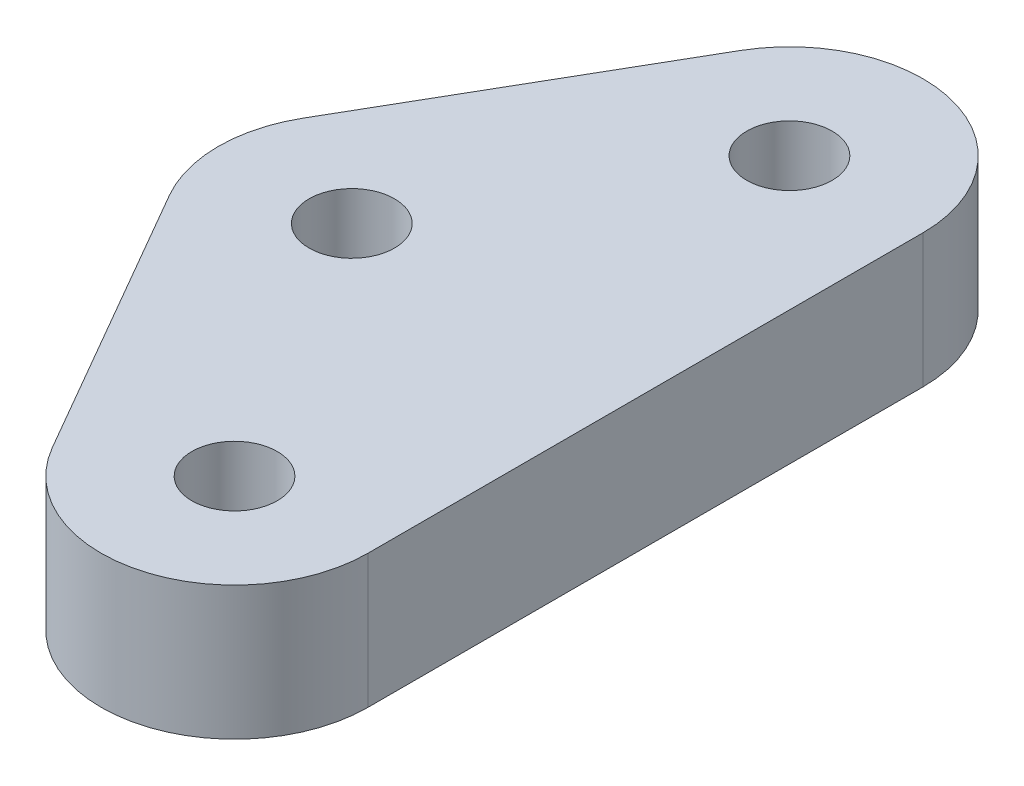
ISO-10303-21;
HEADER;
FILE_DESCRIPTION(('STEP AP214'),'2;1');
FILE_NAME('part.step','',(''),(''),'','','');
FILE_SCHEMA(('AUTOMOTIVE_DESIGN { 1 0 10303 214 1 1 1 1 }'));
ENDSEC;
DATA;
#1=APPLICATION_CONTEXT('core data for automotive mechanical design processes');
#2=APPLICATION_PROTOCOL_DEFINITION('international standard','automotive_design',2000,#1);
#3=PRODUCT_CONTEXT('',#1,'mechanical');
#4=PRODUCT('Part','Part','',(#3));
#5=PRODUCT_RELATED_PRODUCT_CATEGORY('part','',(#4));
#6=PRODUCT_DEFINITION_FORMATION('','',#4);
#7=PRODUCT_DEFINITION_CONTEXT('part definition',#1,'design');
#8=PRODUCT_DEFINITION('design','',#6,#7);
#9=PRODUCT_DEFINITION_SHAPE('','',#8);
#10=(LENGTH_UNIT() NAMED_UNIT(*) SI_UNIT(.MILLI.,.METRE.));
#11=(NAMED_UNIT(*) PLANE_ANGLE_UNIT() SI_UNIT($,.RADIAN.));
#12=(NAMED_UNIT(*) SI_UNIT($,.STERADIAN.) SOLID_ANGLE_UNIT());
#13=UNCERTAINTY_MEASURE_WITH_UNIT(LENGTH_MEASURE(1.E-05),#10,'distance_accuracy_value','');
#14=(GEOMETRIC_REPRESENTATION_CONTEXT(3) GLOBAL_UNCERTAINTY_ASSIGNED_CONTEXT((#13)) GLOBAL_UNIT_ASSIGNED_CONTEXT((#10,
#11,#12)) REPRESENTATION_CONTEXT('',''));
#15=CARTESIAN_POINT('',(0.,0.,0.));
#16=DIRECTION('',(0.,0.,1.));
#17=DIRECTION('',(1.,0.,0.));
#18=AXIS2_PLACEMENT_3D('',#15,#16,#17);
#19=CARTESIAN_POINT('',(5.99999999999998,5.,-10.3923048454133));
#20=DIRECTION('',(0.,1.,0.));
#21=DIRECTION('',(0.,0.,1.));
#22=AXIS2_PLACEMENT_3D('',#19,#20,#21);
#23=PLANE('',#22);
#24=CARTESIAN_POINT('',(5.99999999999998,5.,-10.3923048454133));
#25=DIRECTION('',(0.,1.,0.));
#26=DIRECTION('',(0.,0.,1.));
#27=AXIS2_PLACEMENT_3D('',#24,#25,#26);
#28=CIRCLE('',#27,1.6);
#29=CARTESIAN_POINT('',(5.99999999999998,5.,-8.79230484541328));
#30=VERTEX_POINT('',#29);
#31=EDGE_CURVE('E184',#30,#30,#28,.T.);
#32=ORIENTED_EDGE('',*,*,#31,.F.);
#33=EDGE_LOOP('',(#32));
#34=FACE_BOUND('',#33,.T.);
#35=CARTESIAN_POINT('',(5.99999999999998,5.,-10.3923048454133));
#36=DIRECTION('',(0.,1.,0.));
#37=DIRECTION('',(0.,0.,1.));
#38=AXIS2_PLACEMENT_3D('',#35,#36,#37);
#39=CIRCLE('',#38,5.);
#40=CARTESIAN_POINT('',(11.,5.,-10.3923048454133));
#41=VERTEX_POINT('',#40);
#42=CARTESIAN_POINT('',(1.66987298107778,5.,-12.8923048454133));
#43=VERTEX_POINT('',#42);
#44=EDGE_CURVE('E129',#41,#43,#39,.T.);
#45=ORIENTED_EDGE('',*,*,#44,.T.);
#46=DIRECTION('',(-0.499999999999998,0.,0.86602540378444));
#47=VECTOR('',#46,1.);
#48=CARTESIAN_POINT('',(-4.3301270189222,5.,-2.49999999999999));
#49=LINE('',#48,#47);
#50=CARTESIAN_POINT('',(-4.3301270189222,5.,-2.49999999999999));
#51=VERTEX_POINT('',#50);
#52=EDGE_CURVE('E87',#43,#51,#49,.T.);
#53=ORIENTED_EDGE('',*,*,#52,.T.);
#54=CARTESIAN_POINT('',(0.,5.,0.));
#55=DIRECTION('',(0.,1.,0.));
#56=DIRECTION('',(0.,0.,1.));
#57=AXIS2_PLACEMENT_3D('',#54,#55,#56);
#58=CIRCLE('',#57,5.);
#59=CARTESIAN_POINT('',(-4.3301270189222,5.,2.49999999999999));
#60=VERTEX_POINT('',#59);
#61=EDGE_CURVE('E100',#51,#60,#58,.T.);
#62=ORIENTED_EDGE('',*,*,#61,.T.);
#63=DIRECTION('',(0.499999999999998,0.,0.86602540378444));
#64=VECTOR('',#63,1.);
#65=CARTESIAN_POINT('',(-4.3301270189222,5.,2.49999999999999));
#66=LINE('',#65,#64);
#67=CARTESIAN_POINT('',(1.66987298107778,5.,12.8923048454133));
#68=VERTEX_POINT('',#67);
#69=EDGE_CURVE('E94',#60,#68,#66,.T.);
#70=ORIENTED_EDGE('',*,*,#69,.T.);
#71=CARTESIAN_POINT('',(5.99999999999998,5.,10.3923048454133));
#72=DIRECTION('',(0.,1.,0.));
#73=DIRECTION('',(0.,0.,1.));
#74=AXIS2_PLACEMENT_3D('',#71,#72,#73);
#75=CIRCLE('',#74,5.);
#76=CARTESIAN_POINT('',(11.,5.,10.3923048454133));
#77=VERTEX_POINT('',#76);
#78=EDGE_CURVE('E98',#68,#77,#75,.T.);
#79=ORIENTED_EDGE('',*,*,#78,.T.);
#80=DIRECTION('',(0.,0.,-1.));
#81=VECTOR('',#80,1.);
#82=CARTESIAN_POINT('',(11.,5.,-10.3923048454133));
#83=LINE('',#82,#81);
#84=EDGE_CURVE('E50',#77,#41,#83,.T.);
#85=ORIENTED_EDGE('',*,*,#84,.T.);
#86=EDGE_LOOP('',(#45,#53,#62,#70,#79,#85));
#87=FACE_BOUND('',#86,.T.);
#88=CARTESIAN_POINT('',(0.,5.,0.));
#89=DIRECTION('',(0.,1.,0.));
#90=DIRECTION('',(0.,0.,1.));
#91=AXIS2_PLACEMENT_3D('',#88,#89,#90);
#92=CIRCLE('',#91,1.6);
#93=CARTESIAN_POINT('',(0.,5.,1.6));
#94=VERTEX_POINT('',#93);
#95=EDGE_CURVE('E122',#94,#94,#92,.T.);
#96=ORIENTED_EDGE('',*,*,#95,.F.);
#97=EDGE_LOOP('',(#96));
#98=FACE_BOUND('',#97,.T.);
#99=CARTESIAN_POINT('',(5.99999999999998,5.,10.3923048454133));
#100=DIRECTION('',(0.,1.,0.));
#101=DIRECTION('',(0.,0.,1.));
#102=AXIS2_PLACEMENT_3D('',#99,#100,#101);
#103=CIRCLE('',#102,1.6);
#104=CARTESIAN_POINT('',(5.99999999999998,5.,11.9923048454133));
#105=VERTEX_POINT('',#104);
#106=EDGE_CURVE('E175',#105,#105,#103,.T.);
#107=ORIENTED_EDGE('',*,*,#106,.F.);
#108=EDGE_LOOP('',(#107));
#109=FACE_BOUND('',#108,.T.);
#110=ADVANCED_FACE('F33',(#34,#87,#98,#109),#23,.T.);
#111=CARTESIAN_POINT('',(5.99999999999998,0.,-10.3923048454133));
#112=DIRECTION('',(0.,1.,0.));
#113=DIRECTION('',(0.,0.,1.));
#114=AXIS2_PLACEMENT_3D('',#111,#112,#113);
#115=PLANE('',#114);
#116=CARTESIAN_POINT('',(5.99999999999998,0.,-10.3923048454133));
#117=DIRECTION('',(0.,1.,0.));
#118=DIRECTION('',(0.,0.,1.));
#119=AXIS2_PLACEMENT_3D('',#116,#117,#118);
#120=CIRCLE('',#119,5.);
#121=CARTESIAN_POINT('',(11.,0.,-10.3923048454133));
#122=VERTEX_POINT('',#121);
#123=CARTESIAN_POINT('',(1.66987298107778,0.,-12.8923048454133));
#124=VERTEX_POINT('',#123);
#125=EDGE_CURVE('E118',#122,#124,#120,.T.);
#126=ORIENTED_EDGE('',*,*,#125,.F.);
#127=DIRECTION('',(0.,0.,-1.));
#128=VECTOR('',#127,1.);
#129=CARTESIAN_POINT('',(11.,0.,-10.3923048454133));
#130=LINE('',#129,#128);
#131=CARTESIAN_POINT('',(11.,0.,10.3923048454133));
#132=VERTEX_POINT('',#131);
#133=EDGE_CURVE('E79',#132,#122,#130,.T.);
#134=ORIENTED_EDGE('',*,*,#133,.F.);
#135=CARTESIAN_POINT('',(5.99999999999998,0.,10.3923048454133));
#136=DIRECTION('',(0.,1.,0.));
#137=DIRECTION('',(0.,0.,1.));
#138=AXIS2_PLACEMENT_3D('',#135,#136,#137);
#139=CIRCLE('',#138,5.);
#140=CARTESIAN_POINT('',(1.66987298107778,0.,12.8923048454133));
#141=VERTEX_POINT('',#140);
#142=EDGE_CURVE('E73',#141,#132,#139,.T.);
#143=ORIENTED_EDGE('',*,*,#142,.F.);
#144=DIRECTION('',(0.499999999999998,0.,0.86602540378444));
#145=VECTOR('',#144,1.);
#146=CARTESIAN_POINT('',(-4.3301270189222,0.,2.49999999999999));
#147=LINE('',#146,#145);
#148=CARTESIAN_POINT('',(-4.3301270189222,0.,2.49999999999999));
#149=VERTEX_POINT('',#148);
#150=EDGE_CURVE('E108',#149,#141,#147,.T.);
#151=ORIENTED_EDGE('',*,*,#150,.F.);
#152=CARTESIAN_POINT('',(0.,0.,0.));
#153=DIRECTION('',(0.,1.,0.));
#154=DIRECTION('',(0.,0.,1.));
#155=AXIS2_PLACEMENT_3D('',#152,#153,#154);
#156=CIRCLE('',#155,5.);
#157=CARTESIAN_POINT('',(-4.3301270189222,0.,-2.49999999999999));
#158=VERTEX_POINT('',#157);
#159=EDGE_CURVE('E124',#158,#149,#156,.T.);
#160=ORIENTED_EDGE('',*,*,#159,.F.);
#161=DIRECTION('',(-0.499999999999998,0.,0.86602540378444));
#162=VECTOR('',#161,1.);
#163=CARTESIAN_POINT('',(-4.3301270189222,0.,-2.49999999999999));
#164=LINE('',#163,#162);
#165=EDGE_CURVE('E121',#124,#158,#164,.T.);
#166=ORIENTED_EDGE('',*,*,#165,.F.);
#167=EDGE_LOOP('',(#126,#134,#143,#151,#160,#166));
#168=FACE_BOUND('',#167,.T.);
#169=CARTESIAN_POINT('',(0.,0.,0.));
#170=DIRECTION('',(0.,1.,0.));
#171=DIRECTION('',(0.,0.,1.));
#172=AXIS2_PLACEMENT_3D('',#169,#170,#171);
#173=CIRCLE('',#172,1.6);
#174=CARTESIAN_POINT('',(0.,0.,1.6));
#175=VERTEX_POINT('',#174);
#176=EDGE_CURVE('E187',#175,#175,#173,.T.);
#177=ORIENTED_EDGE('',*,*,#176,.T.);
#178=EDGE_LOOP('',(#177));
#179=FACE_BOUND('',#178,.T.);
#180=CARTESIAN_POINT('',(5.99999999999998,0.,-10.3923048454133));
#181=DIRECTION('',(0.,1.,0.));
#182=DIRECTION('',(0.,0.,1.));
#183=AXIS2_PLACEMENT_3D('',#180,#181,#182);
#184=CIRCLE('',#183,1.6);
#185=CARTESIAN_POINT('',(5.99999999999998,0.,-8.79230484541328));
#186=VERTEX_POINT('',#185);
#187=EDGE_CURVE('E181',#186,#186,#184,.T.);
#188=ORIENTED_EDGE('',*,*,#187,.T.);
#189=EDGE_LOOP('',(#188));
#190=FACE_BOUND('',#189,.T.);
#191=CARTESIAN_POINT('',(5.99999999999998,0.,10.3923048454133));
#192=DIRECTION('',(0.,1.,0.));
#193=DIRECTION('',(0.,0.,1.));
#194=AXIS2_PLACEMENT_3D('',#191,#192,#193);
#195=CIRCLE('',#194,1.6);
#196=CARTESIAN_POINT('',(5.99999999999998,0.,11.9923048454133));
#197=VERTEX_POINT('',#196);
#198=EDGE_CURVE('E178',#197,#197,#195,.T.);
#199=ORIENTED_EDGE('',*,*,#198,.T.);
#200=EDGE_LOOP('',(#199));
#201=FACE_BOUND('',#200,.T.);
#202=ADVANCED_FACE('F138',(#168,#179,#190,#201),#115,.F.);
#203=CARTESIAN_POINT('',(5.99999999999998,5.,-10.3923048454133));
#204=DIRECTION('',(0.,-1.,0.));
#205=DIRECTION('',(0.,0.,-1.));
#206=AXIS2_PLACEMENT_3D('',#203,#204,#205);
#207=CYLINDRICAL_SURFACE('',#206,5.);
#208=ORIENTED_EDGE('',*,*,#125,.T.);
#209=DIRECTION('',(0.,-1.,0.));
#210=VECTOR('',#209,1.);
#211=CARTESIAN_POINT('',(1.66987298107778,5.,-12.8923048454133));
#212=LINE('',#211,#210);
#213=EDGE_CURVE('E11',#43,#124,#212,.T.);
#214=ORIENTED_EDGE('',*,*,#213,.F.);
#215=ORIENTED_EDGE('',*,*,#44,.F.);
#216=DIRECTION('',(0.,-1.,0.));
#217=VECTOR('',#216,1.);
#218=CARTESIAN_POINT('',(11.,5.,-10.3923048454133));
#219=LINE('',#218,#217);
#220=EDGE_CURVE('E114',#41,#122,#219,.T.);
#221=ORIENTED_EDGE('',*,*,#220,.T.);
#222=EDGE_LOOP('',(#208,#214,#215,#221));
#223=FACE_BOUND('',#222,.T.);
#224=ADVANCED_FACE('F35',(#223),#207,.T.);
#225=CARTESIAN_POINT('',(-4.3301270189222,5.,-2.49999999999999));
#226=DIRECTION('',(0.86602540378444,0.,0.499999999999998));
#227=DIRECTION('',(0.499999999999998,0.,-0.86602540378444));
#228=AXIS2_PLACEMENT_3D('',#225,#226,#227);
#229=PLANE('',#228);
#230=ORIENTED_EDGE('',*,*,#165,.T.);
#231=DIRECTION('',(0.,-1.,0.));
#232=VECTOR('',#231,1.);
#233=CARTESIAN_POINT('',(-4.3301270189222,5.,-2.49999999999999));
#234=LINE('',#233,#232);
#235=EDGE_CURVE('E42',#51,#158,#234,.T.);
#236=ORIENTED_EDGE('',*,*,#235,.F.);
#237=ORIENTED_EDGE('',*,*,#52,.F.);
#238=ORIENTED_EDGE('',*,*,#213,.T.);
#239=EDGE_LOOP('',(#230,#236,#237,#238));
#240=FACE_BOUND('',#239,.T.);
#241=ADVANCED_FACE('F237',(#240),#229,.F.);
#242=CARTESIAN_POINT('',(0.,5.,0.));
#243=DIRECTION('',(0.,-1.,0.));
#244=DIRECTION('',(0.,0.,-1.));
#245=AXIS2_PLACEMENT_3D('',#242,#243,#244);
#246=CYLINDRICAL_SURFACE('',#245,5.);
#247=ORIENTED_EDGE('',*,*,#159,.T.);
#248=DIRECTION('',(0.,-1.,0.));
#249=VECTOR('',#248,1.);
#250=CARTESIAN_POINT('',(-4.3301270189222,5.,2.49999999999999));
#251=LINE('',#250,#249);
#252=EDGE_CURVE('E109',#60,#149,#251,.T.);
#253=ORIENTED_EDGE('',*,*,#252,.F.);
#254=ORIENTED_EDGE('',*,*,#61,.F.);
#255=ORIENTED_EDGE('',*,*,#235,.T.);
#256=EDGE_LOOP('',(#247,#253,#254,#255));
#257=FACE_BOUND('',#256,.T.);
#258=ADVANCED_FACE('F135',(#257),#246,.T.);
#259=CARTESIAN_POINT('',(-4.3301270189222,5.,2.49999999999999));
#260=DIRECTION('',(0.86602540378444,0.,-0.499999999999998));
#261=DIRECTION('',(-0.499999999999998,0.,-0.86602540378444));
#262=AXIS2_PLACEMENT_3D('',#259,#260,#261);
#263=PLANE('',#262);
#264=ORIENTED_EDGE('',*,*,#150,.T.);
#265=DIRECTION('',(0.,-1.,0.));
#266=VECTOR('',#265,1.);
#267=CARTESIAN_POINT('',(1.66987298107778,5.,12.8923048454133));
#268=LINE('',#267,#266);
#269=EDGE_CURVE('E105',#68,#141,#268,.T.);
#270=ORIENTED_EDGE('',*,*,#269,.F.);
#271=ORIENTED_EDGE('',*,*,#69,.F.);
#272=ORIENTED_EDGE('',*,*,#252,.T.);
#273=EDGE_LOOP('',(#264,#270,#271,#272));
#274=FACE_BOUND('',#273,.T.);
#275=ADVANCED_FACE('F106',(#274),#263,.F.);
#276=CARTESIAN_POINT('',(5.99999999999998,5.,10.3923048454133));
#277=DIRECTION('',(0.,-1.,0.));
#278=DIRECTION('',(0.,0.,-1.));
#279=AXIS2_PLACEMENT_3D('',#276,#277,#278);
#280=CYLINDRICAL_SURFACE('',#279,5.);
#281=ORIENTED_EDGE('',*,*,#142,.T.);
#282=DIRECTION('',(0.,-1.,0.));
#283=VECTOR('',#282,1.);
#284=CARTESIAN_POINT('',(11.,5.,10.3923048454133));
#285=LINE('',#284,#283);
#286=EDGE_CURVE('E110',#77,#132,#285,.T.);
#287=ORIENTED_EDGE('',*,*,#286,.F.);
#288=ORIENTED_EDGE('',*,*,#78,.F.);
#289=ORIENTED_EDGE('',*,*,#269,.T.);
#290=EDGE_LOOP('',(#281,#287,#288,#289));
#291=FACE_BOUND('',#290,.T.);
#292=ADVANCED_FACE('F112',(#291),#280,.T.);
#293=CARTESIAN_POINT('',(11.,5.,-10.3923048454133));
#294=DIRECTION('',(-1.,0.,0.));
#295=DIRECTION('',(0.,0.,1.));
#296=AXIS2_PLACEMENT_3D('',#293,#294,#295);
#297=PLANE('',#296);
#298=ORIENTED_EDGE('',*,*,#133,.T.);
#299=ORIENTED_EDGE('',*,*,#220,.F.);
#300=ORIENTED_EDGE('',*,*,#84,.F.);
#301=ORIENTED_EDGE('',*,*,#286,.T.);
#302=EDGE_LOOP('',(#298,#299,#300,#301));
#303=FACE_BOUND('',#302,.T.);
#304=ADVANCED_FACE('F143',(#303),#297,.F.);
#305=CARTESIAN_POINT('',(0.,5.,0.));
#306=DIRECTION('',(0.,-1.,0.));
#307=DIRECTION('',(0.,0.,-1.));
#308=AXIS2_PLACEMENT_3D('',#305,#306,#307);
#309=CYLINDRICAL_SURFACE('',#308,1.6);
#310=ORIENTED_EDGE('',*,*,#95,.T.);
#311=EDGE_LOOP('',(#310));
#312=FACE_BOUND('',#311,.T.);
#313=ORIENTED_EDGE('',*,*,#176,.F.);
#314=EDGE_LOOP('',(#313));
#315=FACE_BOUND('',#314,.T.);
#316=ADVANCED_FACE('F145',(#312,#315),#309,.F.);
#317=CARTESIAN_POINT('',(5.99999999999998,5.,-10.3923048454133));
#318=DIRECTION('',(0.,-1.,0.));
#319=DIRECTION('',(0.,0.,-1.));
#320=AXIS2_PLACEMENT_3D('',#317,#318,#319);
#321=CYLINDRICAL_SURFACE('',#320,1.6);
#322=ORIENTED_EDGE('',*,*,#31,.T.);
#323=EDGE_LOOP('',(#322));
#324=FACE_BOUND('',#323,.T.);
#325=ORIENTED_EDGE('',*,*,#187,.F.);
#326=EDGE_LOOP('',(#325));
#327=FACE_BOUND('',#326,.T.);
#328=ADVANCED_FACE('F151',(#324,#327),#321,.F.);
#329=CARTESIAN_POINT('',(5.99999999999998,5.,10.3923048454133));
#330=DIRECTION('',(0.,-1.,0.));
#331=DIRECTION('',(0.,0.,-1.));
#332=AXIS2_PLACEMENT_3D('',#329,#330,#331);
#333=CYLINDRICAL_SURFACE('',#332,1.6);
#334=ORIENTED_EDGE('',*,*,#106,.T.);
#335=EDGE_LOOP('',(#334));
#336=FACE_BOUND('',#335,.T.);
#337=ORIENTED_EDGE('',*,*,#198,.F.);
#338=EDGE_LOOP('',(#337));
#339=FACE_BOUND('',#338,.T.);
#340=ADVANCED_FACE('F166',(#336,#339),#333,.F.);
#341=CLOSED_SHELL('',(#110,#202,#224,#241,#258,#275,#292,#304,#316,#328,#340));
#342=MANIFOLD_SOLID_BREP('B2',#341);
#343=ADVANCED_BREP_SHAPE_REPRESENTATION('',(#18,#342),#14);
#344=SHAPE_DEFINITION_REPRESENTATION(#9,#343);
ENDSEC;
END-ISO-10303-21;
